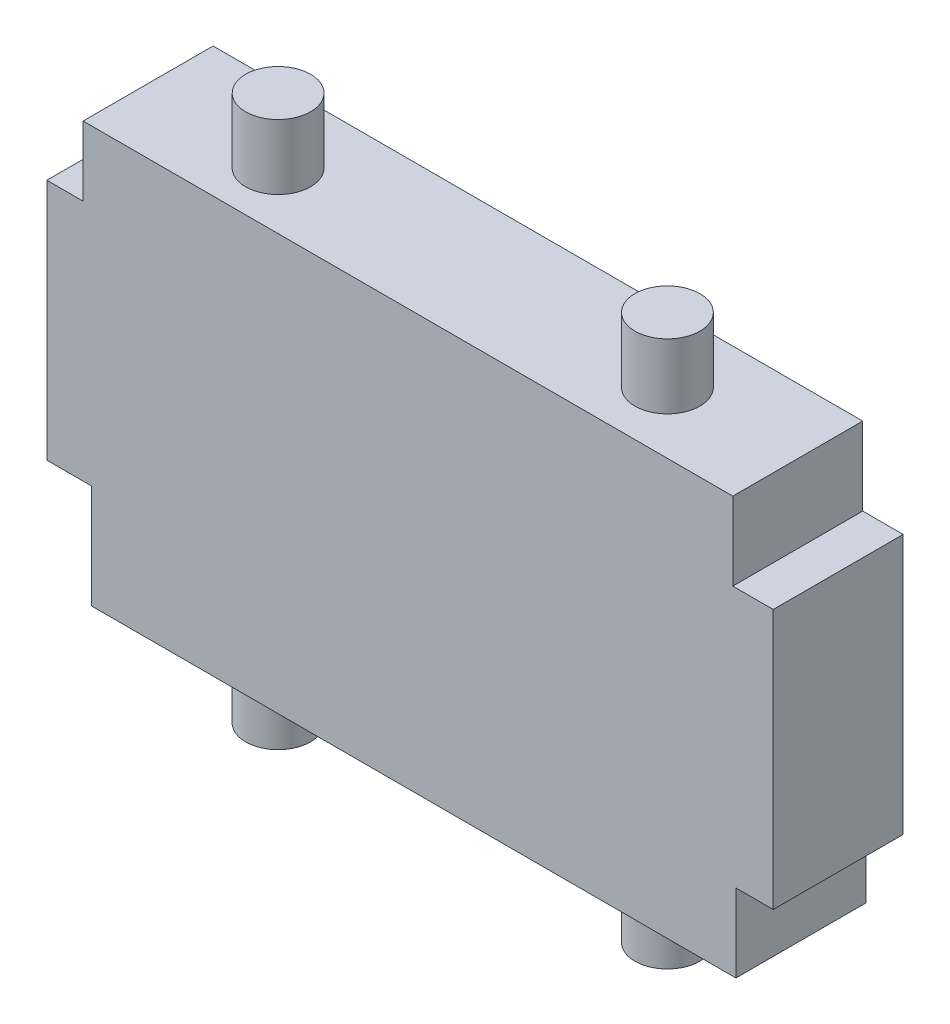
ISO-10303-21;
HEADER;
FILE_DESCRIPTION(('STEP AP214'),'2;1');
FILE_NAME('part.step','',(''),(''),'','','');
FILE_SCHEMA(('AUTOMOTIVE_DESIGN { 1 0 10303 214 1 1 1 1 }'));
ENDSEC;
DATA;
#1=APPLICATION_CONTEXT('core data for automotive mechanical design processes');
#2=APPLICATION_PROTOCOL_DEFINITION('international standard','automotive_design',2000,#1);
#3=PRODUCT_CONTEXT('',#1,'mechanical');
#4=PRODUCT('Part','Part','',(#3));
#5=PRODUCT_RELATED_PRODUCT_CATEGORY('part','',(#4));
#6=PRODUCT_DEFINITION_FORMATION('','',#4);
#7=PRODUCT_DEFINITION_CONTEXT('part definition',#1,'design');
#8=PRODUCT_DEFINITION('design','',#6,#7);
#9=PRODUCT_DEFINITION_SHAPE('','',#8);
#10=(LENGTH_UNIT() NAMED_UNIT(*) SI_UNIT(.MILLI.,.METRE.));
#11=(NAMED_UNIT(*) PLANE_ANGLE_UNIT() SI_UNIT($,.RADIAN.));
#12=(NAMED_UNIT(*) SI_UNIT($,.STERADIAN.) SOLID_ANGLE_UNIT());
#13=UNCERTAINTY_MEASURE_WITH_UNIT(LENGTH_MEASURE(1.E-05),#10,'distance_accuracy_value','');
#14=(GEOMETRIC_REPRESENTATION_CONTEXT(3) GLOBAL_UNCERTAINTY_ASSIGNED_CONTEXT((#13)) GLOBAL_UNIT_ASSIGNED_CONTEXT((#10,
#11,#12)) REPRESENTATION_CONTEXT('',''));
#15=CARTESIAN_POINT('',(0.,0.,0.));
#16=DIRECTION('',(0.,0.,1.));
#17=DIRECTION('',(1.,0.,0.));
#18=AXIS2_PLACEMENT_3D('',#15,#16,#17);
#19=CARTESIAN_POINT('',(0.,33.9274322169059,25.4));
#20=DIRECTION('',(0.,1.,0.));
#21=DIRECTION('',(0.,0.,1.));
#22=AXIS2_PLACEMENT_3D('',#19,#20,#21);
#23=PLANE('',#22);
#24=CARTESIAN_POINT('',(25.0354066985646,33.9274322169059,13.3885454762496));
#25=DIRECTION('',(0.,1.,0.));
#26=DIRECTION('',(0.,0.,1.));
#27=AXIS2_PLACEMENT_3D('',#24,#25,#26);
#28=CIRCLE('',#27,6.35);
#29=CARTESIAN_POINT('',(25.0354066985646,33.9274322169059,19.7385454762496));
#30=VERTEX_POINT('',#29);
#31=EDGE_CURVE('E259',#30,#30,#28,.T.);
#32=ORIENTED_EDGE('',*,*,#31,.F.);
#33=EDGE_LOOP('',(#32));
#34=FACE_BOUND('',#33,.T.);
#35=CARTESIAN_POINT('',(-50.1518341307815,33.9274322169059,14.3066061112487));
#36=DIRECTION('',(0.,1.,0.));
#37=DIRECTION('',(0.,0.,1.));
#38=AXIS2_PLACEMENT_3D('',#35,#36,#37);
#39=CIRCLE('',#38,6.35);
#40=CARTESIAN_POINT('',(-50.1518341307815,33.9274322169059,20.6566061112487));
#41=VERTEX_POINT('',#40);
#42=EDGE_CURVE('E253',#41,#41,#39,.T.);
#43=ORIENTED_EDGE('',*,*,#42,.F.);
#44=EDGE_LOOP('',(#43));
#45=FACE_BOUND('',#44,.T.);
#46=DIRECTION('',(1.,0.,0.));
#47=VECTOR('',#46,1.);
#48=CARTESIAN_POINT('',(0.,33.9274322169059,0.));
#49=LINE('',#48,#47);
#50=CARTESIAN_POINT('',(-77.1722488038278,33.9274322169059,0.));
#51=VERTEX_POINT('',#50);
#52=CARTESIAN_POINT('',(49.8277511961722,33.9274322169059,0.));
#53=VERTEX_POINT('',#52);
#54=EDGE_CURVE('E160',#51,#53,#49,.T.);
#55=ORIENTED_EDGE('',*,*,#54,.F.);
#56=DIRECTION('',(0.,0.,-1.));
#57=VECTOR('',#56,1.);
#58=CARTESIAN_POINT('',(-77.1722488038278,33.9274322169059,25.4));
#59=LINE('',#58,#57);
#60=CARTESIAN_POINT('',(-77.1722488038278,33.9274322169059,25.4));
#61=VERTEX_POINT('',#60);
#62=EDGE_CURVE('E104',#61,#51,#59,.T.);
#63=ORIENTED_EDGE('',*,*,#62,.F.);
#64=DIRECTION('',(1.,0.,0.));
#65=VECTOR('',#64,1.);
#66=CARTESIAN_POINT('',(0.,33.9274322169059,25.4));
#67=LINE('',#66,#65);
#68=CARTESIAN_POINT('',(49.8277511961722,33.9274322169059,25.4));
#69=VERTEX_POINT('',#68);
#70=EDGE_CURVE('E189',#61,#69,#67,.T.);
#71=ORIENTED_EDGE('',*,*,#70,.T.);
#72=DIRECTION('',(0.,0.,-1.));
#73=VECTOR('',#72,1.);
#74=CARTESIAN_POINT('',(49.8277511961722,33.9274322169059,25.4));
#75=LINE('',#74,#73);
#76=EDGE_CURVE('E57',#69,#53,#75,.T.);
#77=ORIENTED_EDGE('',*,*,#76,.T.);
#78=EDGE_LOOP('',(#55,#63,#71,#77));
#79=FACE_BOUND('',#78,.T.);
#80=ADVANCED_FACE('F41',(#34,#45,#79),#23,.T.);
#81=CARTESIAN_POINT('',(-77.1722488038278,0.,25.4));
#82=DIRECTION('',(1.,0.,0.));
#83=DIRECTION('',(0.,0.,-1.));
#84=AXIS2_PLACEMENT_3D('',#81,#82,#83);
#85=PLANE('',#84);
#86=DIRECTION('',(0.,-1.,0.));
#87=VECTOR('',#86,1.);
#88=CARTESIAN_POINT('',(-77.1722488038278,0.,0.));
#89=LINE('',#88,#87);
#90=CARTESIAN_POINT('',(-77.1722488038278,20.3564593301435,0.));
#91=VERTEX_POINT('',#90);
#92=EDGE_CURVE('E162',#51,#91,#89,.T.);
#93=ORIENTED_EDGE('',*,*,#92,.T.);
#94=DIRECTION('',(0.,0.,-1.));
#95=VECTOR('',#94,1.);
#96=CARTESIAN_POINT('',(-77.1722488038278,20.3564593301435,25.4));
#97=LINE('',#96,#95);
#98=CARTESIAN_POINT('',(-77.1722488038278,20.3564593301435,25.4));
#99=VERTEX_POINT('',#98);
#100=EDGE_CURVE('E208',#99,#91,#97,.T.);
#101=ORIENTED_EDGE('',*,*,#100,.F.);
#102=DIRECTION('',(0.,-1.,0.));
#103=VECTOR('',#102,1.);
#104=CARTESIAN_POINT('',(-77.1722488038278,0.,25.4));
#105=LINE('',#104,#103);
#106=EDGE_CURVE('E250',#61,#99,#105,.T.);
#107=ORIENTED_EDGE('',*,*,#106,.F.);
#108=ORIENTED_EDGE('',*,*,#62,.T.);
#109=EDGE_LOOP('',(#93,#101,#107,#108));
#110=FACE_BOUND('',#109,.T.);
#111=ADVANCED_FACE('F287',(#110),#85,.F.);
#112=CARTESIAN_POINT('',(0.,20.3564593301435,25.4));
#113=DIRECTION('',(0.,-1.,0.));
#114=DIRECTION('',(0.,0.,-1.));
#115=AXIS2_PLACEMENT_3D('',#112,#113,#114);
#116=PLANE('',#115);
#117=DIRECTION('',(-1.,0.,0.));
#118=VECTOR('',#117,1.);
#119=CARTESIAN_POINT('',(0.,20.3564593301435,0.));
#120=LINE('',#119,#118);
#121=CARTESIAN_POINT('',(-84.2615629984051,20.3564593301435,0.));
#122=VERTEX_POINT('',#121);
#123=EDGE_CURVE('E165',#91,#122,#120,.T.);
#124=ORIENTED_EDGE('',*,*,#123,.T.);
#125=DIRECTION('',(0.,0.,-1.));
#126=VECTOR('',#125,1.);
#127=CARTESIAN_POINT('',(-84.2615629984051,20.3564593301435,25.4));
#128=LINE('',#127,#126);
#129=CARTESIAN_POINT('',(-84.2615629984051,20.3564593301435,25.4));
#130=VERTEX_POINT('',#129);
#131=EDGE_CURVE('E205',#130,#122,#128,.T.);
#132=ORIENTED_EDGE('',*,*,#131,.F.);
#133=DIRECTION('',(-1.,0.,0.));
#134=VECTOR('',#133,1.);
#135=CARTESIAN_POINT('',(0.,20.3564593301435,25.4));
#136=LINE('',#135,#134);
#137=EDGE_CURVE('E248',#99,#130,#136,.T.);
#138=ORIENTED_EDGE('',*,*,#137,.F.);
#139=ORIENTED_EDGE('',*,*,#100,.T.);
#140=EDGE_LOOP('',(#124,#132,#138,#139));
#141=FACE_BOUND('',#140,.T.);
#142=ADVANCED_FACE('F292',(#141),#116,.F.);
#143=CARTESIAN_POINT('',(-84.2615629984051,0.,25.4));
#144=DIRECTION('',(1.,0.,0.));
#145=DIRECTION('',(0.,0.,-1.));
#146=AXIS2_PLACEMENT_3D('',#143,#144,#145);
#147=PLANE('',#146);
#148=DIRECTION('',(0.,-1.,0.));
#149=VECTOR('',#148,1.);
#150=CARTESIAN_POINT('',(-84.2615629984051,0.,0.));
#151=LINE('',#150,#149);
#152=CARTESIAN_POINT('',(-84.2615629984051,-27.0406698564593,0.));
#153=VERTEX_POINT('',#152);
#154=EDGE_CURVE('E167',#122,#153,#151,.T.);
#155=ORIENTED_EDGE('',*,*,#154,.T.);
#156=DIRECTION('',(0.,0.,-1.));
#157=VECTOR('',#156,1.);
#158=CARTESIAN_POINT('',(-84.2615629984051,-27.0406698564593,25.4));
#159=LINE('',#158,#157);
#160=CARTESIAN_POINT('',(-84.2615629984051,-27.0406698564593,25.4));
#161=VERTEX_POINT('',#160);
#162=EDGE_CURVE('E202',#161,#153,#159,.T.);
#163=ORIENTED_EDGE('',*,*,#162,.F.);
#164=DIRECTION('',(0.,-1.,0.));
#165=VECTOR('',#164,1.);
#166=CARTESIAN_POINT('',(-84.2615629984051,0.,25.4));
#167=LINE('',#166,#165);
#168=EDGE_CURVE('E246',#130,#161,#167,.T.);
#169=ORIENTED_EDGE('',*,*,#168,.F.);
#170=ORIENTED_EDGE('',*,*,#131,.T.);
#171=EDGE_LOOP('',(#155,#163,#169,#170));
#172=FACE_BOUND('',#171,.T.);
#173=ADVANCED_FACE('F322',(#172),#147,.F.);
#174=CARTESIAN_POINT('',(0.,-27.0406698564593,25.4));
#175=DIRECTION('',(0.,1.,0.));
#176=DIRECTION('',(0.,0.,1.));
#177=AXIS2_PLACEMENT_3D('',#174,#175,#176);
#178=PLANE('',#177);
#179=DIRECTION('',(1.,0.,0.));
#180=VECTOR('',#179,1.);
#181=CARTESIAN_POINT('',(0.,-27.0406698564593,0.));
#182=LINE('',#181,#180);
#183=CARTESIAN_POINT('',(-75.5518341307815,-27.0406698564593,0.));
#184=VERTEX_POINT('',#183);
#185=EDGE_CURVE('E169',#153,#184,#182,.T.);
#186=ORIENTED_EDGE('',*,*,#185,.T.);
#187=DIRECTION('',(0.,0.,-1.));
#188=VECTOR('',#187,1.);
#189=CARTESIAN_POINT('',(-75.5518341307815,-27.0406698564593,25.4));
#190=LINE('',#189,#188);
#191=CARTESIAN_POINT('',(-75.5518341307815,-27.0406698564593,25.4));
#192=VERTEX_POINT('',#191);
#193=EDGE_CURVE('E200',#192,#184,#190,.T.);
#194=ORIENTED_EDGE('',*,*,#193,.F.);
#195=DIRECTION('',(1.,0.,0.));
#196=VECTOR('',#195,1.);
#197=CARTESIAN_POINT('',(0.,-27.0406698564593,25.4));
#198=LINE('',#197,#196);
#199=EDGE_CURVE('E244',#161,#192,#198,.T.);
#200=ORIENTED_EDGE('',*,*,#199,.F.);
#201=ORIENTED_EDGE('',*,*,#162,.T.);
#202=EDGE_LOOP('',(#186,#194,#200,#201));
#203=FACE_BOUND('',#202,.T.);
#204=ADVANCED_FACE('F318',(#203),#178,.F.);
#205=CARTESIAN_POINT('',(-75.5518341307816,-1.03239227210108E-13,25.4));
#206=DIRECTION('',(-1.,0.,0.));
#207=DIRECTION('',(0.,-1.,0.));
#208=AXIS2_PLACEMENT_3D('',#205,#206,#207);
#209=PLANE('',#208);
#210=DIRECTION('',(0.,1.,0.));
#211=VECTOR('',#210,1.);
#212=CARTESIAN_POINT('',(-75.5518341307816,-1.03239227210108E-13,0.));
#213=LINE('',#212,#211);
#214=CARTESIAN_POINT('',(-75.5518341307815,-47.3525677830941,0.));
#215=VERTEX_POINT('',#214);
#216=EDGE_CURVE('E172',#215,#184,#213,.T.);
#217=ORIENTED_EDGE('',*,*,#216,.F.);
#218=DIRECTION('',(0.,0.,-1.));
#219=VECTOR('',#218,1.);
#220=CARTESIAN_POINT('',(-75.5518341307815,-47.3525677830941,25.4));
#221=LINE('',#220,#219);
#222=CARTESIAN_POINT('',(-75.5518341307815,-47.3525677830941,25.4));
#223=VERTEX_POINT('',#222);
#224=EDGE_CURVE('E198',#223,#215,#221,.T.);
#225=ORIENTED_EDGE('',*,*,#224,.F.);
#226=DIRECTION('',(0.,1.,0.));
#227=VECTOR('',#226,1.);
#228=CARTESIAN_POINT('',(-75.5518341307816,-1.03239227210108E-13,25.4));
#229=LINE('',#228,#227);
#230=EDGE_CURVE('E241',#223,#192,#229,.T.);
#231=ORIENTED_EDGE('',*,*,#230,.T.);
#232=ORIENTED_EDGE('',*,*,#193,.T.);
#233=EDGE_LOOP('',(#217,#225,#231,#232));
#234=FACE_BOUND('',#233,.T.);
#235=ADVANCED_FACE('F220',(#234),#209,.T.);
#236=CARTESIAN_POINT('',(0.,-47.3525677830941,25.4));
#237=DIRECTION('',(0.,1.,0.));
#238=DIRECTION('',(-1.,0.,0.));
#239=AXIS2_PLACEMENT_3D('',#236,#237,#238);
#240=PLANE('',#239);
#241=CARTESIAN_POINT('',(25.0354066985646,-47.3525677830941,13.3885454762496));
#242=DIRECTION('',(0.,1.,0.));
#243=DIRECTION('',(-1.,0.,0.));
#244=AXIS2_PLACEMENT_3D('',#241,#242,#243);
#245=CIRCLE('',#244,6.35);
#246=CARTESIAN_POINT('',(18.6854066985646,-47.3525677830941,13.3885454762496));
#247=VERTEX_POINT('',#246);
#248=EDGE_CURVE('E11',#247,#247,#245,.F.);
#249=ORIENTED_EDGE('',*,*,#248,.F.);
#250=EDGE_LOOP('',(#249));
#251=FACE_BOUND('',#250,.T.);
#252=CARTESIAN_POINT('',(-50.1518341307815,-47.3525677830941,14.3066061112487));
#253=DIRECTION('',(0.,1.,0.));
#254=DIRECTION('',(-1.,0.,0.));
#255=AXIS2_PLACEMENT_3D('',#252,#253,#254);
#256=CIRCLE('',#255,6.35);
#257=CARTESIAN_POINT('',(-56.5018341307815,-47.3525677830941,14.3066061112487));
#258=VERTEX_POINT('',#257);
#259=EDGE_CURVE('E49',#258,#258,#256,.F.);
#260=ORIENTED_EDGE('',*,*,#259,.F.);
#261=EDGE_LOOP('',(#260));
#262=FACE_BOUND('',#261,.T.);
#263=DIRECTION('',(1.,0.,0.));
#264=VECTOR('',#263,1.);
#265=CARTESIAN_POINT('',(0.,-47.3525677830941,0.));
#266=LINE('',#265,#264);
#267=CARTESIAN_POINT('',(50.4354066985646,-47.3525677830941,0.));
#268=VERTEX_POINT('',#267);
#269=EDGE_CURVE('E175',#215,#268,#266,.T.);
#270=ORIENTED_EDGE('',*,*,#269,.T.);
#271=DIRECTION('',(0.,0.,-1.));
#272=VECTOR('',#271,1.);
#273=CARTESIAN_POINT('',(50.4354066985646,-47.3525677830941,25.4));
#274=LINE('',#273,#272);
#275=CARTESIAN_POINT('',(50.4354066985646,-47.3525677830941,25.4));
#276=VERTEX_POINT('',#275);
#277=EDGE_CURVE('E195',#276,#268,#274,.T.);
#278=ORIENTED_EDGE('',*,*,#277,.F.);
#279=DIRECTION('',(1.,0.,0.));
#280=VECTOR('',#279,1.);
#281=CARTESIAN_POINT('',(0.,-47.3525677830941,25.4));
#282=LINE('',#281,#280);
#283=EDGE_CURVE('E237',#223,#276,#282,.T.);
#284=ORIENTED_EDGE('',*,*,#283,.F.);
#285=ORIENTED_EDGE('',*,*,#224,.T.);
#286=EDGE_LOOP('',(#270,#278,#284,#285));
#287=FACE_BOUND('',#286,.T.);
#288=ADVANCED_FACE('F216',(#251,#262,#287),#240,.F.);
#289=CARTESIAN_POINT('',(50.4354066985646,0.,25.4));
#290=DIRECTION('',(-1.,0.,0.));
#291=DIRECTION('',(0.,0.,1.));
#292=AXIS2_PLACEMENT_3D('',#289,#290,#291);
#293=PLANE('',#292);
#294=DIRECTION('',(0.,1.,0.));
#295=VECTOR('',#294,1.);
#296=CARTESIAN_POINT('',(50.4354066985646,0.,0.));
#297=LINE('',#296,#295);
#298=CARTESIAN_POINT('',(50.4354066985646,-32.1125677830941,0.));
#299=VERTEX_POINT('',#298);
#300=EDGE_CURVE('E177',#268,#299,#297,.T.);
#301=ORIENTED_EDGE('',*,*,#300,.T.);
#302=DIRECTION('',(0.,0.,-1.));
#303=VECTOR('',#302,1.);
#304=CARTESIAN_POINT('',(50.4354066985646,-32.1125677830941,25.4));
#305=LINE('',#304,#303);
#306=CARTESIAN_POINT('',(50.4354066985646,-32.1125677830941,25.4));
#307=VERTEX_POINT('',#306);
#308=EDGE_CURVE('E193',#307,#299,#305,.T.);
#309=ORIENTED_EDGE('',*,*,#308,.F.);
#310=DIRECTION('',(0.,1.,0.));
#311=VECTOR('',#310,1.);
#312=CARTESIAN_POINT('',(50.4354066985646,0.,25.4));
#313=LINE('',#312,#311);
#314=EDGE_CURVE('E232',#276,#307,#313,.T.);
#315=ORIENTED_EDGE('',*,*,#314,.F.);
#316=ORIENTED_EDGE('',*,*,#277,.T.);
#317=EDGE_LOOP('',(#301,#309,#315,#316));
#318=FACE_BOUND('',#317,.T.);
#319=ADVANCED_FACE('F219',(#318),#293,.F.);
#320=CARTESIAN_POINT('',(0.,-32.1125677830941,25.4));
#321=DIRECTION('',(0.,-1.,0.));
#322=DIRECTION('',(0.,0.,-1.));
#323=AXIS2_PLACEMENT_3D('',#320,#321,#322);
#324=PLANE('',#323);
#325=DIRECTION('',(-1.,0.,0.));
#326=VECTOR('',#325,1.);
#327=CARTESIAN_POINT('',(0.,-32.1125677830941,0.));
#328=LINE('',#327,#326);
#329=CARTESIAN_POINT('',(57.7272727272727,-32.1125677830941,0.));
#330=VERTEX_POINT('',#329);
#331=EDGE_CURVE('E180',#330,#299,#328,.T.);
#332=ORIENTED_EDGE('',*,*,#331,.F.);
#333=DIRECTION('',(0.,0.,-1.));
#334=VECTOR('',#333,1.);
#335=CARTESIAN_POINT('',(57.7272727272727,-32.1125677830941,25.4));
#336=LINE('',#335,#334);
#337=CARTESIAN_POINT('',(57.7272727272727,-32.1125677830941,25.4));
#338=VERTEX_POINT('',#337);
#339=EDGE_CURVE('E142',#338,#330,#336,.T.);
#340=ORIENTED_EDGE('',*,*,#339,.F.);
#341=DIRECTION('',(-1.,0.,0.));
#342=VECTOR('',#341,1.);
#343=CARTESIAN_POINT('',(0.,-32.1125677830941,25.4));
#344=LINE('',#343,#342);
#345=EDGE_CURVE('E152',#338,#307,#344,.T.);
#346=ORIENTED_EDGE('',*,*,#345,.T.);
#347=ORIENTED_EDGE('',*,*,#308,.T.);
#348=EDGE_LOOP('',(#332,#340,#346,#347));
#349=FACE_BOUND('',#348,.T.);
#350=ADVANCED_FACE('F236',(#349),#324,.T.);
#351=CARTESIAN_POINT('',(57.7272727272727,0.,25.4));
#352=DIRECTION('',(1.,0.,0.));
#353=DIRECTION('',(0.,1.,0.));
#354=AXIS2_PLACEMENT_3D('',#351,#352,#353);
#355=PLANE('',#354);
#356=DIRECTION('',(0.,-1.,0.));
#357=VECTOR('',#356,1.);
#358=CARTESIAN_POINT('',(57.7272727272727,0.,0.));
#359=LINE('',#358,#357);
#360=CARTESIAN_POINT('',(57.7272727272727,18.6874322169059,0.));
#361=VERTEX_POINT('',#360);
#362=EDGE_CURVE('E138',#361,#330,#359,.T.);
#363=ORIENTED_EDGE('',*,*,#362,.F.);
#364=DIRECTION('',(0.,0.,-1.));
#365=VECTOR('',#364,1.);
#366=CARTESIAN_POINT('',(57.7272727272727,18.6874322169059,25.4));
#367=LINE('',#366,#365);
#368=CARTESIAN_POINT('',(57.7272727272727,18.6874322169059,25.4));
#369=VERTEX_POINT('',#368);
#370=EDGE_CURVE('E133',#369,#361,#367,.T.);
#371=ORIENTED_EDGE('',*,*,#370,.F.);
#372=DIRECTION('',(0.,-1.,0.));
#373=VECTOR('',#372,1.);
#374=CARTESIAN_POINT('',(57.7272727272727,0.,25.4));
#375=LINE('',#374,#373);
#376=EDGE_CURVE('E136',#369,#338,#375,.T.);
#377=ORIENTED_EDGE('',*,*,#376,.T.);
#378=ORIENTED_EDGE('',*,*,#339,.T.);
#379=EDGE_LOOP('',(#363,#371,#377,#378));
#380=FACE_BOUND('',#379,.T.);
#381=ADVANCED_FACE('F135',(#380),#355,.T.);
#382=CARTESIAN_POINT('',(0.,18.6874322169059,25.4));
#383=DIRECTION('',(0.,1.,0.));
#384=DIRECTION('',(0.,0.,1.));
#385=AXIS2_PLACEMENT_3D('',#382,#383,#384);
#386=PLANE('',#385);
#387=DIRECTION('',(1.,0.,0.));
#388=VECTOR('',#387,1.);
#389=CARTESIAN_POINT('',(0.,18.6874322169059,0.));
#390=LINE('',#389,#388);
#391=CARTESIAN_POINT('',(49.8277511961722,18.6874322169059,0.));
#392=VERTEX_POINT('',#391);
#393=EDGE_CURVE('E184',#392,#361,#390,.T.);
#394=ORIENTED_EDGE('',*,*,#393,.F.);
#395=DIRECTION('',(0.,0.,-1.));
#396=VECTOR('',#395,1.);
#397=CARTESIAN_POINT('',(49.8277511961722,18.6874322169059,25.4));
#398=LINE('',#397,#396);
#399=CARTESIAN_POINT('',(49.8277511961722,18.6874322169059,25.4));
#400=VERTEX_POINT('',#399);
#401=EDGE_CURVE('E95',#400,#392,#398,.T.);
#402=ORIENTED_EDGE('',*,*,#401,.F.);
#403=DIRECTION('',(1.,0.,0.));
#404=VECTOR('',#403,1.);
#405=CARTESIAN_POINT('',(0.,18.6874322169059,25.4));
#406=LINE('',#405,#404);
#407=EDGE_CURVE('E150',#400,#369,#406,.T.);
#408=ORIENTED_EDGE('',*,*,#407,.T.);
#409=ORIENTED_EDGE('',*,*,#370,.T.);
#410=EDGE_LOOP('',(#394,#402,#408,#409));
#411=FACE_BOUND('',#410,.T.);
#412=ADVANCED_FACE('F154',(#411),#386,.T.);
#413=CARTESIAN_POINT('',(49.8277511961722,0.,25.4));
#414=DIRECTION('',(1.,0.,0.));
#415=DIRECTION('',(0.,0.,-1.));
#416=AXIS2_PLACEMENT_3D('',#413,#414,#415);
#417=PLANE('',#416);
#418=DIRECTION('',(0.,-1.,0.));
#419=VECTOR('',#418,1.);
#420=CARTESIAN_POINT('',(49.8277511961722,0.,0.));
#421=LINE('',#420,#419);
#422=EDGE_CURVE('E186',#53,#392,#421,.T.);
#423=ORIENTED_EDGE('',*,*,#422,.F.);
#424=ORIENTED_EDGE('',*,*,#76,.F.);
#425=DIRECTION('',(0.,-1.,0.));
#426=VECTOR('',#425,1.);
#427=CARTESIAN_POINT('',(49.8277511961722,0.,25.4));
#428=LINE('',#427,#426);
#429=EDGE_CURVE('E155',#69,#400,#428,.T.);
#430=ORIENTED_EDGE('',*,*,#429,.T.);
#431=ORIENTED_EDGE('',*,*,#401,.T.);
#432=EDGE_LOOP('',(#423,#424,#430,#431));
#433=FACE_BOUND('',#432,.T.);
#434=ADVANCED_FACE('F299',(#433),#417,.T.);
#435=CARTESIAN_POINT('',(0.,0.,25.4));
#436=DIRECTION('',(0.,0.,1.));
#437=DIRECTION('',(1.,0.,0.));
#438=AXIS2_PLACEMENT_3D('',#435,#436,#437);
#439=PLANE('',#438);
#440=ORIENTED_EDGE('',*,*,#70,.F.);
#441=ORIENTED_EDGE('',*,*,#106,.T.);
#442=ORIENTED_EDGE('',*,*,#137,.T.);
#443=ORIENTED_EDGE('',*,*,#168,.T.);
#444=ORIENTED_EDGE('',*,*,#199,.T.);
#445=ORIENTED_EDGE('',*,*,#230,.F.);
#446=ORIENTED_EDGE('',*,*,#283,.T.);
#447=ORIENTED_EDGE('',*,*,#314,.T.);
#448=ORIENTED_EDGE('',*,*,#345,.F.);
#449=ORIENTED_EDGE('',*,*,#376,.F.);
#450=ORIENTED_EDGE('',*,*,#407,.F.);
#451=ORIENTED_EDGE('',*,*,#429,.F.);
#452=EDGE_LOOP('',(#440,#441,#442,#443,#444,#445,#446,#447,#448,#449,#450,#451));
#453=FACE_BOUND('',#452,.T.);
#454=ADVANCED_FACE('F148',(#453),#439,.T.);
#455=CARTESIAN_POINT('',(0.,0.,0.));
#456=DIRECTION('',(0.,0.,1.));
#457=DIRECTION('',(1.,0.,0.));
#458=AXIS2_PLACEMENT_3D('',#455,#456,#457);
#459=PLANE('',#458);
#460=ORIENTED_EDGE('',*,*,#54,.T.);
#461=ORIENTED_EDGE('',*,*,#422,.T.);
#462=ORIENTED_EDGE('',*,*,#393,.T.);
#463=ORIENTED_EDGE('',*,*,#362,.T.);
#464=ORIENTED_EDGE('',*,*,#331,.T.);
#465=ORIENTED_EDGE('',*,*,#300,.F.);
#466=ORIENTED_EDGE('',*,*,#269,.F.);
#467=ORIENTED_EDGE('',*,*,#216,.T.);
#468=ORIENTED_EDGE('',*,*,#185,.F.);
#469=ORIENTED_EDGE('',*,*,#154,.F.);
#470=ORIENTED_EDGE('',*,*,#123,.F.);
#471=ORIENTED_EDGE('',*,*,#92,.F.);
#472=EDGE_LOOP('',(#460,#461,#462,#463,#464,#465,#466,#467,#468,#469,#470,#471));
#473=FACE_BOUND('',#472,.T.);
#474=ADVANCED_FACE('F233',(#473),#459,.F.);
#475=CARTESIAN_POINT('',(-50.1518341307815,46.6274322169059,14.3066061112487));
#476=DIRECTION('',(0.,-1.,0.));
#477=DIRECTION('',(0.,0.,-1.));
#478=AXIS2_PLACEMENT_3D('',#475,#476,#477);
#479=CYLINDRICAL_SURFACE('',#478,6.35);
#480=CARTESIAN_POINT('',(-50.1518341307815,46.6274322169059,14.3066061112487));
#481=DIRECTION('',(0.,1.,0.));
#482=DIRECTION('',(0.,0.,1.));
#483=AXIS2_PLACEMENT_3D('',#480,#481,#482);
#484=CIRCLE('',#483,6.35);
#485=CARTESIAN_POINT('',(-50.1518341307815,46.6274322169059,20.6566061112487));
#486=VERTEX_POINT('',#485);
#487=EDGE_CURVE('E163',#486,#486,#484,.T.);
#488=ORIENTED_EDGE('',*,*,#487,.F.);
#489=EDGE_LOOP('',(#488));
#490=FACE_BOUND('',#489,.T.);
#491=ORIENTED_EDGE('',*,*,#42,.T.);
#492=EDGE_LOOP('',(#491));
#493=FACE_BOUND('',#492,.T.);
#494=ADVANCED_FACE('F395',(#490,#493),#479,.T.);
#495=CARTESIAN_POINT('',(-50.1518341307815,46.6274322169059,14.3066061112487));
#496=DIRECTION('',(0.,1.,0.));
#497=DIRECTION('',(0.,0.,1.));
#498=AXIS2_PLACEMENT_3D('',#495,#496,#497);
#499=PLANE('',#498);
#500=ORIENTED_EDGE('',*,*,#487,.T.);
#501=EDGE_LOOP('',(#500));
#502=FACE_BOUND('',#501,.T.);
#503=ADVANCED_FACE('F409',(#502),#499,.T.);
#504=CARTESIAN_POINT('',(25.0354066985646,46.6274322169059,13.3885454762496));
#505=DIRECTION('',(0.,-1.,0.));
#506=DIRECTION('',(0.,0.,-1.));
#507=AXIS2_PLACEMENT_3D('',#504,#505,#506);
#508=CYLINDRICAL_SURFACE('',#507,6.35);
#509=CARTESIAN_POINT('',(25.0354066985646,46.6274322169059,13.3885454762496));
#510=DIRECTION('',(0.,1.,0.));
#511=DIRECTION('',(0.,0.,1.));
#512=AXIS2_PLACEMENT_3D('',#509,#510,#511);
#513=CIRCLE('',#512,6.35);
#514=CARTESIAN_POINT('',(25.0354066985646,46.6274322169059,19.7385454762496));
#515=VERTEX_POINT('',#514);
#516=EDGE_CURVE('E256',#515,#515,#513,.T.);
#517=ORIENTED_EDGE('',*,*,#516,.F.);
#518=EDGE_LOOP('',(#517));
#519=FACE_BOUND('',#518,.T.);
#520=ORIENTED_EDGE('',*,*,#31,.T.);
#521=EDGE_LOOP('',(#520));
#522=FACE_BOUND('',#521,.T.);
#523=ADVANCED_FACE('F419',(#519,#522),#508,.T.);
#524=CARTESIAN_POINT('',(25.0354066985646,46.6274322169059,13.3885454762496));
#525=DIRECTION('',(0.,1.,0.));
#526=DIRECTION('',(0.,0.,1.));
#527=AXIS2_PLACEMENT_3D('',#524,#525,#526);
#528=PLANE('',#527);
#529=ORIENTED_EDGE('',*,*,#516,.T.);
#530=EDGE_LOOP('',(#529));
#531=FACE_BOUND('',#530,.T.);
#532=ADVANCED_FACE('F428',(#531),#528,.T.);
#533=CARTESIAN_POINT('',(-50.1518341307815,-60.0525677830941,14.3066061112487));
#534=DIRECTION('',(0.,1.,0.));
#535=DIRECTION('',(-1.,0.,0.));
#536=AXIS2_PLACEMENT_3D('',#533,#534,#535);
#537=CYLINDRICAL_SURFACE('',#536,6.35);
#538=CARTESIAN_POINT('',(-50.1518341307815,-60.0525677830941,14.3066061112487));
#539=DIRECTION('',(0.,-1.,0.));
#540=DIRECTION('',(1.,0.,0.));
#541=AXIS2_PLACEMENT_3D('',#538,#539,#540);
#542=CIRCLE('',#541,6.35);
#543=CARTESIAN_POINT('',(-43.8018341307815,-60.0525677830941,14.3066061112487));
#544=VERTEX_POINT('',#543);
#545=EDGE_CURVE('E262',#544,#544,#542,.T.);
#546=ORIENTED_EDGE('',*,*,#545,.F.);
#547=EDGE_LOOP('',(#546));
#548=FACE_BOUND('',#547,.T.);
#549=ORIENTED_EDGE('',*,*,#259,.T.);
#550=EDGE_LOOP('',(#549));
#551=FACE_BOUND('',#550,.T.);
#552=ADVANCED_FACE('F214',(#548,#551),#537,.T.);
#553=CARTESIAN_POINT('',(-50.1518341307815,-60.0525677830941,14.3066061112487));
#554=DIRECTION('',(0.,-1.,0.));
#555=DIRECTION('',(1.,0.,0.));
#556=AXIS2_PLACEMENT_3D('',#553,#554,#555);
#557=PLANE('',#556);
#558=ORIENTED_EDGE('',*,*,#545,.T.);
#559=EDGE_LOOP('',(#558));
#560=FACE_BOUND('',#559,.T.);
#561=ADVANCED_FACE('F276',(#560),#557,.T.);
#562=CARTESIAN_POINT('',(25.0354066985646,-60.0525677830941,13.3885454762496));
#563=DIRECTION('',(0.,1.,0.));
#564=DIRECTION('',(-1.,0.,0.));
#565=AXIS2_PLACEMENT_3D('',#562,#563,#564);
#566=CYLINDRICAL_SURFACE('',#565,6.35);
#567=CARTESIAN_POINT('',(25.0354066985646,-60.0525677830941,13.3885454762496));
#568=DIRECTION('',(0.,-1.,0.));
#569=DIRECTION('',(1.,0.,0.));
#570=AXIS2_PLACEMENT_3D('',#567,#568,#569);
#571=CIRCLE('',#570,6.35);
#572=CARTESIAN_POINT('',(31.3854066985646,-60.0525677830941,13.3885454762496));
#573=VERTEX_POINT('',#572);
#574=EDGE_CURVE('E267',#573,#573,#571,.T.);
#575=ORIENTED_EDGE('',*,*,#574,.F.);
#576=EDGE_LOOP('',(#575));
#577=FACE_BOUND('',#576,.T.);
#578=ORIENTED_EDGE('',*,*,#248,.T.);
#579=EDGE_LOOP('',(#578));
#580=FACE_BOUND('',#579,.T.);
#581=ADVANCED_FACE('F273',(#577,#580),#566,.T.);
#582=CARTESIAN_POINT('',(25.0354066985646,-60.0525677830941,13.3885454762496));
#583=DIRECTION('',(0.,-1.,0.));
#584=DIRECTION('',(1.,0.,0.));
#585=AXIS2_PLACEMENT_3D('',#582,#583,#584);
#586=PLANE('',#585);
#587=ORIENTED_EDGE('',*,*,#574,.T.);
#588=EDGE_LOOP('',(#587));
#589=FACE_BOUND('',#588,.T.);
#590=ADVANCED_FACE('F271',(#589),#586,.T.);
#591=CLOSED_SHELL('',(#80,#111,#142,#173,#204,#235,#288,#319,#350,#381,#412,#434,#454,#474,#494,
#503,#523,#532,#552,#561,#581,#590));
#592=MANIFOLD_SOLID_BREP('B2',#591);
#593=ADVANCED_BREP_SHAPE_REPRESENTATION('',(#18,#592),#14);
#594=SHAPE_DEFINITION_REPRESENTATION(#9,#593);
ENDSEC;
END-ISO-10303-21;
